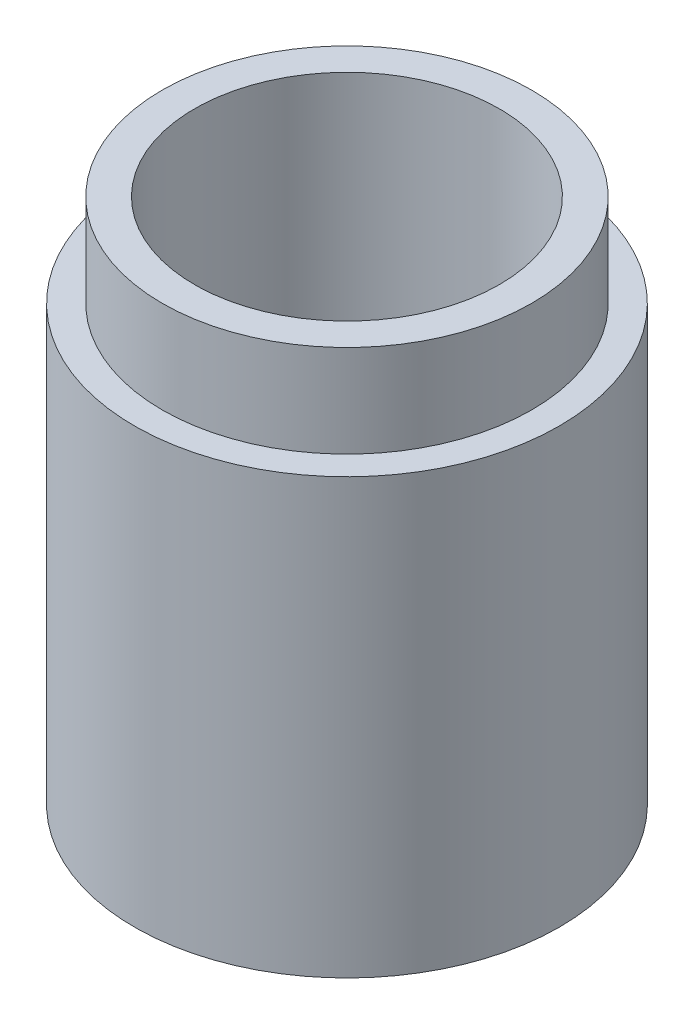
ISO-10303-21;
HEADER;
FILE_DESCRIPTION(('STEP AP214'),'2;1');
FILE_NAME('part.step','',(''),(''),'','','');
FILE_SCHEMA(('AUTOMOTIVE_DESIGN { 1 0 10303 214 1 1 1 1 }'));
ENDSEC;
DATA;
#1=APPLICATION_CONTEXT('core data for automotive mechanical design processes');
#2=APPLICATION_PROTOCOL_DEFINITION('international standard','automotive_design',2000,#1);
#3=PRODUCT_CONTEXT('',#1,'mechanical');
#4=PRODUCT('Part','Part','',(#3));
#5=PRODUCT_RELATED_PRODUCT_CATEGORY('part','',(#4));
#6=PRODUCT_DEFINITION_FORMATION('','',#4);
#7=PRODUCT_DEFINITION_CONTEXT('part definition',#1,'design');
#8=PRODUCT_DEFINITION('design','',#6,#7);
#9=PRODUCT_DEFINITION_SHAPE('','',#8);
#10=(LENGTH_UNIT() NAMED_UNIT(*) SI_UNIT(.MILLI.,.METRE.));
#11=(NAMED_UNIT(*) PLANE_ANGLE_UNIT() SI_UNIT($,.RADIAN.));
#12=(NAMED_UNIT(*) SI_UNIT($,.STERADIAN.) SOLID_ANGLE_UNIT());
#13=UNCERTAINTY_MEASURE_WITH_UNIT(LENGTH_MEASURE(1.E-05),#10,'distance_accuracy_value','');
#14=(GEOMETRIC_REPRESENTATION_CONTEXT(3) GLOBAL_UNCERTAINTY_ASSIGNED_CONTEXT((#13)) GLOBAL_UNIT_ASSIGNED_CONTEXT((#10,
#11,#12)) REPRESENTATION_CONTEXT('',''));
#15=CARTESIAN_POINT('',(0.,0.,0.));
#16=DIRECTION('',(0.,0.,1.));
#17=DIRECTION('',(1.,0.,0.));
#18=AXIS2_PLACEMENT_3D('',#15,#16,#17);
#19=CARTESIAN_POINT('',(2.3,0.,0.));
#20=DIRECTION('',(0.,-1.,0.));
#21=DIRECTION('',(1.,0.,0.));
#22=AXIS2_PLACEMENT_3D('',#19,#20,#21);
#23=PLANE('',#22);
#24=CARTESIAN_POINT('',(0.,0.,0.));
#25=DIRECTION('',(0.,-1.,0.));
#26=DIRECTION('',(1.,0.,0.));
#27=AXIS2_PLACEMENT_3D('',#24,#25,#26);
#28=CIRCLE('',#27,2.3);
#29=CARTESIAN_POINT('',(2.3,0.,0.));
#30=VERTEX_POINT('',#29);
#31=EDGE_CURVE('E68',#30,#30,#28,.T.);
#32=ORIENTED_EDGE('',*,*,#31,.T.);
#33=EDGE_LOOP('',(#32));
#34=FACE_BOUND('',#33,.T.);
#35=CARTESIAN_POINT('',(0.,0.,0.));
#36=DIRECTION('',(0.,-1.,0.));
#37=DIRECTION('',(1.,0.,0.));
#38=AXIS2_PLACEMENT_3D('',#35,#36,#37);
#39=CIRCLE('',#38,1.64999999999999);
#40=CARTESIAN_POINT('',(1.64999999999999,0.,0.));
#41=VERTEX_POINT('',#40);
#42=EDGE_CURVE('E10',#41,#41,#39,.T.);
#43=ORIENTED_EDGE('',*,*,#42,.F.);
#44=EDGE_LOOP('',(#43));
#45=FACE_BOUND('',#44,.T.);
#46=ADVANCED_FACE('F41',(#34,#45),#23,.T.);
#47=CARTESIAN_POINT('',(6.70686854305713E-13,-195.521332277502,0.));
#48=DIRECTION('',(0.,-1.,0.));
#49=DIRECTION('',(1.,0.,0.));
#50=AXIS2_PLACEMENT_3D('',#47,#48,#49);
#51=CYLINDRICAL_SURFACE('',#50,1.65000000000001);
#52=ORIENTED_EDGE('',*,*,#42,.T.);
#53=EDGE_LOOP('',(#52));
#54=FACE_BOUND('',#53,.T.);
#55=CARTESIAN_POINT('',(0.,5.70000000000001,0.));
#56=DIRECTION('',(0.,-1.,0.));
#57=DIRECTION('',(1.,0.,0.));
#58=AXIS2_PLACEMENT_3D('',#55,#56,#57);
#59=CIRCLE('',#58,1.65000000000002);
#60=CARTESIAN_POINT('',(1.65,5.70000000000002,0.));
#61=VERTEX_POINT('',#60);
#62=EDGE_CURVE('E48',#61,#61,#59,.T.);
#63=ORIENTED_EDGE('',*,*,#62,.F.);
#64=EDGE_LOOP('',(#63));
#65=FACE_BOUND('',#64,.T.);
#66=ADVANCED_FACE('F87',(#54,#65),#51,.F.);
#67=CARTESIAN_POINT('',(1.65,5.7,0.));
#68=DIRECTION('',(0.,1.,0.));
#69=DIRECTION('',(-1.,0.,0.));
#70=AXIS2_PLACEMENT_3D('',#67,#68,#69);
#71=PLANE('',#70);
#72=ORIENTED_EDGE('',*,*,#62,.T.);
#73=EDGE_LOOP('',(#72));
#74=FACE_BOUND('',#73,.T.);
#75=CARTESIAN_POINT('',(0.,5.70000000000001,0.));
#76=DIRECTION('',(0.,-1.,0.));
#77=DIRECTION('',(1.,0.,0.));
#78=AXIS2_PLACEMENT_3D('',#75,#76,#77);
#79=CIRCLE('',#78,2.00000000000002);
#80=CARTESIAN_POINT('',(2.,5.70000000000002,0.));
#81=VERTEX_POINT('',#80);
#82=EDGE_CURVE('E53',#81,#81,#79,.T.);
#83=ORIENTED_EDGE('',*,*,#82,.F.);
#84=EDGE_LOOP('',(#83));
#85=FACE_BOUND('',#84,.T.);
#86=ADVANCED_FACE('F91',(#74,#85),#71,.T.);
#87=CARTESIAN_POINT('',(6.70686854305713E-13,-195.521332277502,0.));
#88=DIRECTION('',(0.,-1.,0.));
#89=DIRECTION('',(1.,0.,0.));
#90=AXIS2_PLACEMENT_3D('',#87,#88,#89);
#91=CYLINDRICAL_SURFACE('',#90,2.00000000000002);
#92=ORIENTED_EDGE('',*,*,#82,.T.);
#93=EDGE_LOOP('',(#92));
#94=FACE_BOUND('',#93,.T.);
#95=CARTESIAN_POINT('',(0.,4.70000000000001,0.));
#96=DIRECTION('',(0.,-1.,0.));
#97=DIRECTION('',(1.,0.,0.));
#98=AXIS2_PLACEMENT_3D('',#95,#96,#97);
#99=CIRCLE('',#98,2.00000000000002);
#100=CARTESIAN_POINT('',(2.,4.70000000000002,0.));
#101=VERTEX_POINT('',#100);
#102=EDGE_CURVE('E58',#101,#101,#99,.T.);
#103=ORIENTED_EDGE('',*,*,#102,.F.);
#104=EDGE_LOOP('',(#103));
#105=FACE_BOUND('',#104,.T.);
#106=ADVANCED_FACE('F83',(#94,#105),#91,.T.);
#107=CARTESIAN_POINT('',(2.,4.7,0.));
#108=DIRECTION('',(0.,1.,0.));
#109=DIRECTION('',(-1.,0.,0.));
#110=AXIS2_PLACEMENT_3D('',#107,#108,#109);
#111=PLANE('',#110);
#112=ORIENTED_EDGE('',*,*,#102,.T.);
#113=EDGE_LOOP('',(#112));
#114=FACE_BOUND('',#113,.T.);
#115=CARTESIAN_POINT('',(0.,4.70000000000001,0.));
#116=DIRECTION('',(0.,-1.,0.));
#117=DIRECTION('',(1.,0.,0.));
#118=AXIS2_PLACEMENT_3D('',#115,#116,#117);
#119=CIRCLE('',#118,2.30000000000002);
#120=CARTESIAN_POINT('',(2.3,4.70000000000002,0.));
#121=VERTEX_POINT('',#120);
#122=EDGE_CURVE('E64',#121,#121,#119,.T.);
#123=ORIENTED_EDGE('',*,*,#122,.F.);
#124=EDGE_LOOP('',(#123));
#125=FACE_BOUND('',#124,.T.);
#126=ADVANCED_FACE('F77',(#114,#125),#111,.T.);
#127=CARTESIAN_POINT('',(6.70686854305713E-13,-195.521332277502,0.));
#128=DIRECTION('',(0.,-1.,0.));
#129=DIRECTION('',(1.,0.,0.));
#130=AXIS2_PLACEMENT_3D('',#127,#128,#129);
#131=CYLINDRICAL_SURFACE('',#130,2.30000000000001);
#132=ORIENTED_EDGE('',*,*,#122,.T.);
#133=EDGE_LOOP('',(#132));
#134=FACE_BOUND('',#133,.T.);
#135=ORIENTED_EDGE('',*,*,#31,.F.);
#136=EDGE_LOOP('',(#135));
#137=FACE_BOUND('',#136,.T.);
#138=ADVANCED_FACE('F75',(#134,#137),#131,.T.);
#139=CLOSED_SHELL('',(#46,#66,#86,#106,#126,#138));
#140=MANIFOLD_SOLID_BREP('B2',#139);
#141=ADVANCED_BREP_SHAPE_REPRESENTATION('',(#18,#140),#14);
#142=SHAPE_DEFINITION_REPRESENTATION(#9,#141);
ENDSEC;
END-ISO-10303-21;
